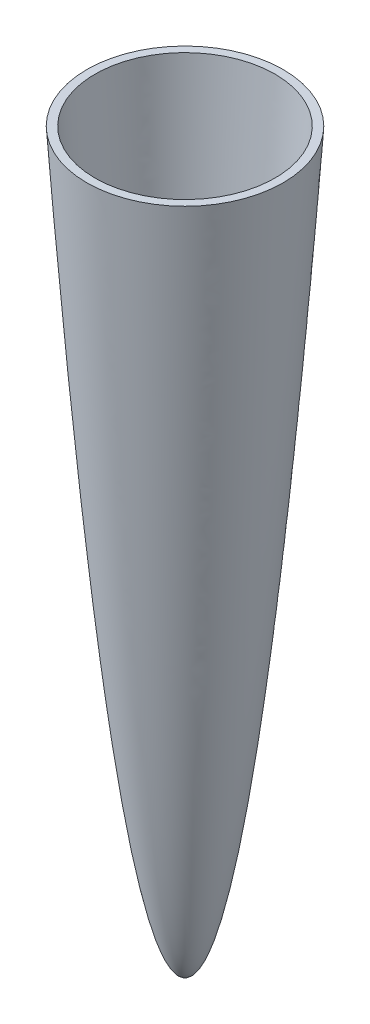
ISO-10303-21;
HEADER;
FILE_DESCRIPTION(('STEP AP214'),'2;1');
FILE_NAME('part.step','',(''),(''),'','','');
FILE_SCHEMA(('AUTOMOTIVE_DESIGN { 1 0 10303 214 1 1 1 1 }'));
ENDSEC;
DATA;
#1=APPLICATION_CONTEXT('core data for automotive mechanical design processes');
#2=APPLICATION_PROTOCOL_DEFINITION('international standard','automotive_design',2000,#1);
#3=PRODUCT_CONTEXT('',#1,'mechanical');
#4=PRODUCT('Part','Part','',(#3));
#5=PRODUCT_RELATED_PRODUCT_CATEGORY('part','',(#4));
#6=PRODUCT_DEFINITION_FORMATION('','',#4);
#7=PRODUCT_DEFINITION_CONTEXT('part definition',#1,'design');
#8=PRODUCT_DEFINITION('design','',#6,#7);
#9=PRODUCT_DEFINITION_SHAPE('','',#8);
#10=(LENGTH_UNIT() NAMED_UNIT(*) SI_UNIT(.MILLI.,.METRE.));
#11=(NAMED_UNIT(*) PLANE_ANGLE_UNIT() SI_UNIT($,.RADIAN.));
#12=(NAMED_UNIT(*) SI_UNIT($,.STERADIAN.) SOLID_ANGLE_UNIT());
#13=UNCERTAINTY_MEASURE_WITH_UNIT(LENGTH_MEASURE(1.E-05),#10,'distance_accuracy_value','');
#14=(GEOMETRIC_REPRESENTATION_CONTEXT(3) GLOBAL_UNCERTAINTY_ASSIGNED_CONTEXT((#13)) GLOBAL_UNIT_ASSIGNED_CONTEXT((#10,
#11,#12)) REPRESENTATION_CONTEXT('',''));
#15=CARTESIAN_POINT('',(0.,0.,0.));
#16=DIRECTION('',(0.,0.,1.));
#17=DIRECTION('',(1.,0.,0.));
#18=AXIS2_PLACEMENT_3D('',#15,#16,#17);
#19=CARTESIAN_POINT('',(0.,76.2000000004684,10.1600000000003));
#20=CARTESIAN_POINT('',(0.,74.7953846571365,10.0663589771115));
#21=CARTESIAN_POINT('',(0.,72.7473040314489,9.92773735160393));
#22=CARTESIAN_POINT('',(0.,68.8401863387655,9.66006919957504));
#23=CARTESIAN_POINT('',(0.,65.6159405163852,9.42799284261022));
#24=CARTESIAN_POINT('',(0.,62.20279171474,9.18152174917999));
#25=CARTESIAN_POINT('',(0.,58.5310589779573,8.90605346480777));
#26=CARTESIAN_POINT('',(0.,53.7902325802933,8.54106325184212));
#27=CARTESIAN_POINT('',(0.,48.4689748714666,8.10934752365375));
#28=CARTESIAN_POINT('',(0.,42.2620805619876,7.57511276599957));
#29=CARTESIAN_POINT('',(0.,36.1283727396532,7.00601064574842));
#30=CARTESIAN_POINT('',(0.,29.9584412724386,6.38453887481498));
#31=CARTESIAN_POINT('',(0.,23.8204534960815,5.69950330459421));
#32=CARTESIAN_POINT('',(0.,17.6770340309319,4.92306743156959));
#33=CARTESIAN_POINT('',(0.,12.0721232974398,4.08576760292201));
#34=CARTESIAN_POINT('',(0.,7.5026568470972,3.23949587224086));
#35=CARTESIAN_POINT('',(0.,4.22844034366863,2.43676520242052));
#36=CARTESIAN_POINT('',(0.,2.34737209867719,1.80995045039345));
#37=CARTESIAN_POINT('',(0.,1.38884925696848,1.38759116656676));
#38=CARTESIAN_POINT('',(0.,0.869307696433011,1.09572865711445));
#39=CARTESIAN_POINT('',(0.,0.566581742738673,0.883511493563717));
#40=CARTESIAN_POINT('',(0.,0.376526852371539,0.720038284422021));
#41=CARTESIAN_POINT('',(0.,0.251410524214915,0.588422444365977));
#42=CARTESIAN_POINT('',(0.,0.164164018898701,0.476214071077587));
#43=CARTESIAN_POINT('',(0.,0.104559628784595,0.380764738468906));
#44=CARTESIAN_POINT('',(0.,0.0642408631424736,0.299023720358921));
#45=CARTESIAN_POINT('',(0.,0.024818991861977,0.195438377862435));
#46=CARTESIAN_POINT('',(0.,0.00630492304577305,0.113776475130942));
#47=CARTESIAN_POINT('',(0.,9.03533767538339E-05,0.0494090621705873));
#48=CARTESIAN_POINT('',(0.,4.67734056459656E-10,0.));
#49=B_SPLINE_CURVE_WITH_KNOTS('',4,(#19,#20,#21,#22,#23,#24,#25,#26,#27,#28,#29,#30,#31,#32,#33,
#34,#35,#36,#37,#38,#39,#40,#41,#42,#43,#44,#45,#46,#47,#48),.UNSPECIFIED.,.F.,.F.,(5,1,1,1,1,1,
1,1,1,1,1,1,1,1,1,1,1,1,1,1,1,1,1,1,1,1,5),(0.,0.0726371507642473,0.10895572628846,
0.145274301812672,0.181592877391619,0.217911452970565,0.290548603627151,0.363185754614504,
0.435822906005376,0.508460056618858,0.581097206769795,0.653734356783465,0.726371508949171,
0.799008642014097,0.847465152994195,0.871812326883784,0.884671304455111,0.891994134878557,
0.896613805134336,0.899752336148347,0.90201385940733,0.903748514661905,0.905130866120753,
0.906417449294691,0.907290627021661,0.908022494049043,0.9103294377903),.UNSPECIFIED.);
#50=CARTESIAN_POINT('',(0.,4.67710448940111E-10,0.));
#51=DIRECTION('',(0.,-1.,0.));
#52=AXIS1_PLACEMENT('',#50,#51);
#53=SURFACE_OF_REVOLUTION('',#49,#52);
#54=CARTESIAN_POINT('',(0.,4.67710448940111E-10,0.));
#55=VERTEX_POINT('',#54);
#56=VERTEX_LOOP('',#55);
#57=FACE_BOUND('',#56,.T.);
#58=CARTESIAN_POINT('',(0.,76.2000000004677,0.));
#59=DIRECTION('',(0.,-1.,0.));
#60=DIRECTION('',(0.,0.,-1.));
#61=AXIS2_PLACEMENT_3D('',#58,#59,#60);
#62=CIRCLE('',#61,10.1600000000003);
#63=CARTESIAN_POINT('',(0.,76.2000000004677,-10.1600000000003));
#64=VERTEX_POINT('',#63);
#65=EDGE_CURVE('E51',#64,#64,#62,.T.);
#66=ORIENTED_EDGE('',*,*,#65,.T.);
#67=EDGE_LOOP('',(#66));
#68=FACE_BOUND('',#67,.T.);
#69=ADVANCED_FACE('F43',(#57,#68),#53,.T.);
#70=CARTESIAN_POINT('',(0.,0.999999999999871,0.));
#71=CARTESIAN_POINT('',(0.,0.999894151022708,0.0431824771829106));
#72=CARTESIAN_POINT('',(0.,1.00574657551984,0.10038254658758));
#73=CARTESIAN_POINT('',(0.,1.02381077134031,0.172604796478969));
#74=CARTESIAN_POINT('',(0.,1.06163181133597,0.262407906639629));
#75=CARTESIAN_POINT('',(0.,1.09976170500459,0.332378611368444));
#76=CARTESIAN_POINT('',(0.,1.15457664193689,0.412539247878802));
#77=CARTESIAN_POINT('',(0.,1.2341044602871,0.506623383448542));
#78=CARTESIAN_POINT('',(0.,1.34930067423989,0.618801294363119));
#79=CARTESIAN_POINT('',(0.,1.52747064611257,0.760552223067267));
#80=CARTESIAN_POINT('',(0.,1.81837303237236,0.949272975990027));
#81=CARTESIAN_POINT('',(0.,2.34088971871529,1.21863016871376));
#82=CARTESIAN_POINT('',(0.,3.34857113597992,1.62188425552454));
#83=CARTESIAN_POINT('',(0.,5.41694781643192,2.23594028975783));
#84=CARTESIAN_POINT('',(0.,8.84271232861444,2.97500463359434));
#85=CARTESIAN_POINT('',(0.,13.5230398047246,3.74928877686097));
#86=CARTESIAN_POINT('',(0.,19.1375888454044,4.50867216632394));
#87=CARTESIAN_POINT('',(0.,25.1472469547295,5.20532712592461));
#88=CARTESIAN_POINT('',(0.,31.1105762249523,5.8230609241016));
#89=CARTESIAN_POINT('',(0.,37.1648254661981,6.391931758239));
#90=CARTESIAN_POINT('',(0.,43.0844762911316,6.90986693271738));
#91=CARTESIAN_POINT('',(0.,49.2331370670098,7.40900115115807));
#92=CARTESIAN_POINT('',(0.,55.0125510670453,7.8566625496667));
#93=CARTESIAN_POINT('',(0.,61.40525154065,8.32065586017433));
#94=CARTESIAN_POINT('',(0.,66.7887805027466,8.69972767981933));
#95=CARTESIAN_POINT('',(0.,72.0768737184911,9.05169495095179));
#96=CARTESIAN_POINT('',(0.,74.835591087637,9.23187473086092));
#97=CARTESIAN_POINT('',(0.,76.2043125618441,9.32008742298758));
#98=B_SPLINE_CURVE_WITH_KNOTS('',4,(#70,#71,#72,#73,#74,#75,#76,#77,#78,#79,#80,#81,#82,#83,#84,
#85,#86,#87,#88,#89,#90,#91,#92,#93,#94,#95,#96,#97),.UNSPECIFIED.,.F.,.F.,(5,1,1,1,1,1,1,1,1,1,
1,1,1,1,1,1,1,1,1,1,1,1,1,1,5),(0.,0.00204478053152616,0.00274421870590902,0.00352770175088376,
0.00464000679824841,0.00583915966157113,0.00736911556049352,0.0093934534580946,
0.0123016311040775,0.0166752060768497,0.0239000437169845,0.0373638288769793,0.0640649440758292,
0.119351696228995,0.191238892671153,0.263126094588119,0.33501329778759,0.406900500614089,
0.47878770353637,0.550674906549062,0.622562109610914,0.694449312691542,0.766336515784832,
0.838223718882339,0.910110921980129),.UNSPECIFIED.);
#99=CARTESIAN_POINT('',(0.,4.67710448940111E-10,0.));
#100=DIRECTION('',(0.,-1.,0.));
#101=AXIS1_PLACEMENT('',#99,#100);
#102=SURFACE_OF_REVOLUTION('',#98,#101);
#103=CARTESIAN_POINT('',(0.,76.2043125618441,0.));
#104=DIRECTION('',(0.,-1.,0.));
#105=DIRECTION('',(0.,0.,-1.));
#106=AXIS2_PLACEMENT_3D('',#103,#104,#105);
#107=CIRCLE('',#106,9.3200874229876);
#108=CARTESIAN_POINT('',(0.,76.2043125618441,-9.32008742298761));
#109=VERTEX_POINT('',#108);
#110=EDGE_CURVE('E11',#109,#109,#107,.T.);
#111=ORIENTED_EDGE('',*,*,#110,.F.);
#112=EDGE_LOOP('',(#111));
#113=FACE_BOUND('',#112,.T.);
#114=CARTESIAN_POINT('',(0.,0.999999999999871,0.));
#115=VERTEX_POINT('',#114);
#116=VERTEX_LOOP('',#115);
#117=FACE_BOUND('',#116,.T.);
#118=ADVANCED_FACE('F59',(#113,#117),#102,.T.);
#119=CARTESIAN_POINT('',(0.,76.2043125618441,0.));
#120=DIRECTION('',(0.,-1.,0.));
#121=DIRECTION('',(0.,0.,-1.));
#122=AXIS2_PLACEMENT_3D('',#119,#120,#121);
#123=CONICAL_SURFACE('',#122,9.3200874229876,1.5656618359003);
#124=ORIENTED_EDGE('',*,*,#65,.F.);
#125=EDGE_LOOP('',(#124));
#126=FACE_BOUND('',#125,.T.);
#127=ORIENTED_EDGE('',*,*,#110,.T.);
#128=EDGE_LOOP('',(#127));
#129=FACE_BOUND('',#128,.T.);
#130=ADVANCED_FACE('F75',(#126,#129),#123,.T.);
#131=CLOSED_SHELL('',(#69,#118,#130));
#132=MANIFOLD_SOLID_BREP('B2',#131);
#133=ADVANCED_BREP_SHAPE_REPRESENTATION('',(#18,#132),#14);
#134=SHAPE_DEFINITION_REPRESENTATION(#9,#133);
ENDSEC;
END-ISO-10303-21;
